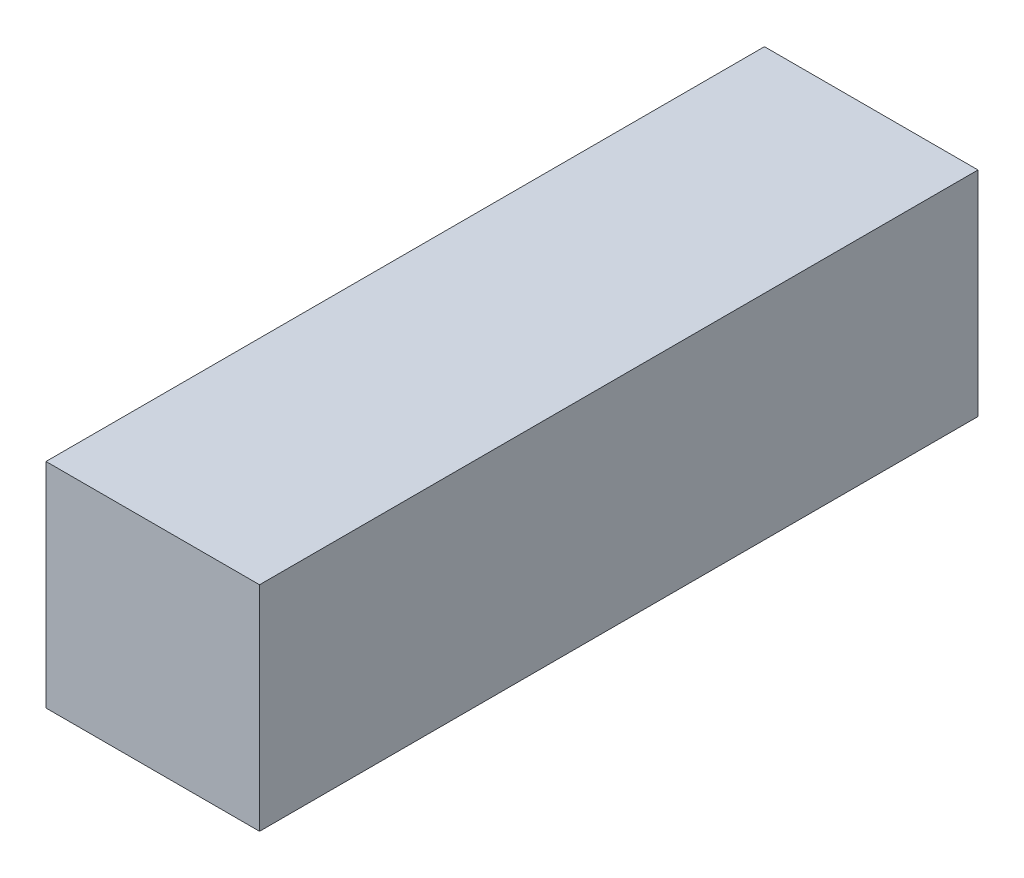
ISO-10303-21;
HEADER;
FILE_DESCRIPTION(('STEP AP214'),'2;1');
FILE_NAME('part.step','',(''),(''),'','','');
FILE_SCHEMA(('AUTOMOTIVE_DESIGN { 1 0 10303 214 1 1 1 1 }'));
ENDSEC;
DATA;
#1=APPLICATION_CONTEXT('core data for automotive mechanical design processes');
#2=APPLICATION_PROTOCOL_DEFINITION('international standard','automotive_design',2000,#1);
#3=PRODUCT_CONTEXT('',#1,'mechanical');
#4=PRODUCT('Part','Part','',(#3));
#5=PRODUCT_RELATED_PRODUCT_CATEGORY('part','',(#4));
#6=PRODUCT_DEFINITION_FORMATION('','',#4);
#7=PRODUCT_DEFINITION_CONTEXT('part definition',#1,'design');
#8=PRODUCT_DEFINITION('design','',#6,#7);
#9=PRODUCT_DEFINITION_SHAPE('','',#8);
#10=(LENGTH_UNIT() NAMED_UNIT(*) SI_UNIT(.MILLI.,.METRE.));
#11=(NAMED_UNIT(*) PLANE_ANGLE_UNIT() SI_UNIT($,.RADIAN.));
#12=(NAMED_UNIT(*) SI_UNIT($,.STERADIAN.) SOLID_ANGLE_UNIT());
#13=UNCERTAINTY_MEASURE_WITH_UNIT(LENGTH_MEASURE(1.E-05),#10,'distance_accuracy_value','');
#14=(GEOMETRIC_REPRESENTATION_CONTEXT(3) GLOBAL_UNCERTAINTY_ASSIGNED_CONTEXT((#13)) GLOBAL_UNIT_ASSIGNED_CONTEXT((#10,
#11,#12)) REPRESENTATION_CONTEXT('',''));
#15=CARTESIAN_POINT('',(0.,0.,0.));
#16=DIRECTION('',(0.,0.,1.));
#17=DIRECTION('',(1.,0.,0.));
#18=AXIS2_PLACEMENT_3D('',#15,#16,#17);
#19=CARTESIAN_POINT('',(-9.525,19.05,0.));
#20=DIRECTION('',(1.,0.,0.));
#21=DIRECTION('',(0.,0.,-1.));
#22=AXIS2_PLACEMENT_3D('',#19,#20,#21);
#23=PLANE('',#22);
#24=DIRECTION('',(0.,0.,1.));
#25=VECTOR('',#24,1.);
#26=CARTESIAN_POINT('',(-9.525,0.,0.));
#27=LINE('',#26,#25);
#28=CARTESIAN_POINT('',(-9.525,0.,0.));
#29=VERTEX_POINT('',#28);
#30=CARTESIAN_POINT('',(-9.52500000000001,0.,64.0912757557309));
#31=VERTEX_POINT('',#30);
#32=EDGE_CURVE('E96',#29,#31,#27,.T.);
#33=ORIENTED_EDGE('',*,*,#32,.T.);
#34=DIRECTION('',(0.,-1.,0.));
#35=VECTOR('',#34,1.);
#36=CARTESIAN_POINT('',(-9.52500000000001,19.05,64.0912757557309));
#37=LINE('',#36,#35);
#38=CARTESIAN_POINT('',(-9.52500000000001,19.05,64.0912757557309));
#39=VERTEX_POINT('',#38);
#40=EDGE_CURVE('E11',#39,#31,#37,.T.);
#41=ORIENTED_EDGE('',*,*,#40,.F.);
#42=DIRECTION('',(0.,0.,1.));
#43=VECTOR('',#42,1.);
#44=CARTESIAN_POINT('',(-9.525,19.05,0.));
#45=LINE('',#44,#43);
#46=CARTESIAN_POINT('',(-9.525,19.05,0.));
#47=VERTEX_POINT('',#46);
#48=EDGE_CURVE('E84',#47,#39,#45,.T.);
#49=ORIENTED_EDGE('',*,*,#48,.F.);
#50=DIRECTION('',(0.,-1.,0.));
#51=VECTOR('',#50,1.);
#52=CARTESIAN_POINT('',(-9.525,19.05,0.));
#53=LINE('',#52,#51);
#54=EDGE_CURVE('E92',#47,#29,#53,.T.);
#55=ORIENTED_EDGE('',*,*,#54,.T.);
#56=EDGE_LOOP('',(#33,#41,#49,#55));
#57=FACE_BOUND('',#56,.T.);
#58=ADVANCED_FACE('F33',(#57),#23,.F.);
#59=CARTESIAN_POINT('',(-9.52500000000001,19.05,64.0912757557309));
#60=DIRECTION('',(0.,0.,-1.));
#61=DIRECTION('',(-1.,0.,0.));
#62=AXIS2_PLACEMENT_3D('',#59,#60,#61);
#63=PLANE('',#62);
#64=DIRECTION('',(1.,0.,0.));
#65=VECTOR('',#64,1.);
#66=CARTESIAN_POINT('',(-9.52500000000001,0.,64.0912757557309));
#67=LINE('',#66,#65);
#68=CARTESIAN_POINT('',(9.52500000000003,0.,64.0912757557309));
#69=VERTEX_POINT('',#68);
#70=EDGE_CURVE('E88',#31,#69,#67,.T.);
#71=ORIENTED_EDGE('',*,*,#70,.T.);
#72=DIRECTION('',(0.,-1.,0.));
#73=VECTOR('',#72,1.);
#74=CARTESIAN_POINT('',(9.52500000000003,19.05,64.0912757557309));
#75=LINE('',#74,#73);
#76=CARTESIAN_POINT('',(9.52500000000003,19.05,64.0912757557309));
#77=VERTEX_POINT('',#76);
#78=EDGE_CURVE('E41',#77,#69,#75,.T.);
#79=ORIENTED_EDGE('',*,*,#78,.F.);
#80=DIRECTION('',(1.,0.,0.));
#81=VECTOR('',#80,1.);
#82=CARTESIAN_POINT('',(-9.52500000000001,19.05,64.0912757557309));
#83=LINE('',#82,#81);
#84=EDGE_CURVE('E79',#39,#77,#83,.T.);
#85=ORIENTED_EDGE('',*,*,#84,.F.);
#86=ORIENTED_EDGE('',*,*,#40,.T.);
#87=EDGE_LOOP('',(#71,#79,#85,#86));
#88=FACE_BOUND('',#87,.T.);
#89=ADVANCED_FACE('F87',(#88),#63,.F.);
#90=CARTESIAN_POINT('',(9.525,19.05,0.));
#91=DIRECTION('',(-1.,0.,0.));
#92=DIRECTION('',(0.,0.,1.));
#93=AXIS2_PLACEMENT_3D('',#90,#91,#92);
#94=PLANE('',#93);
#95=DIRECTION('',(0.,0.,-1.));
#96=VECTOR('',#95,1.);
#97=CARTESIAN_POINT('',(9.525,0.,0.));
#98=LINE('',#97,#96);
#99=CARTESIAN_POINT('',(9.525,0.,0.));
#100=VERTEX_POINT('',#99);
#101=EDGE_CURVE('E66',#69,#100,#98,.T.);
#102=ORIENTED_EDGE('',*,*,#101,.T.);
#103=DIRECTION('',(0.,-1.,0.));
#104=VECTOR('',#103,1.);
#105=CARTESIAN_POINT('',(9.525,19.05,0.));
#106=LINE('',#105,#104);
#107=CARTESIAN_POINT('',(9.525,19.05,0.));
#108=VERTEX_POINT('',#107);
#109=EDGE_CURVE('E89',#108,#100,#106,.T.);
#110=ORIENTED_EDGE('',*,*,#109,.F.);
#111=DIRECTION('',(0.,0.,-1.));
#112=VECTOR('',#111,1.);
#113=CARTESIAN_POINT('',(9.525,19.05,0.));
#114=LINE('',#113,#112);
#115=EDGE_CURVE('E82',#77,#108,#114,.T.);
#116=ORIENTED_EDGE('',*,*,#115,.F.);
#117=ORIENTED_EDGE('',*,*,#78,.T.);
#118=EDGE_LOOP('',(#102,#110,#116,#117));
#119=FACE_BOUND('',#118,.T.);
#120=ADVANCED_FACE('F90',(#119),#94,.F.);
#121=CARTESIAN_POINT('',(-9.525,19.05,0.));
#122=DIRECTION('',(0.,0.,1.));
#123=DIRECTION('',(1.,0.,0.));
#124=AXIS2_PLACEMENT_3D('',#121,#122,#123);
#125=PLANE('',#124);
#126=DIRECTION('',(-1.,0.,0.));
#127=VECTOR('',#126,1.);
#128=CARTESIAN_POINT('',(-9.525,0.,0.));
#129=LINE('',#128,#127);
#130=EDGE_CURVE('E72',#100,#29,#129,.T.);
#131=ORIENTED_EDGE('',*,*,#130,.T.);
#132=ORIENTED_EDGE('',*,*,#54,.F.);
#133=DIRECTION('',(-1.,0.,0.));
#134=VECTOR('',#133,1.);
#135=CARTESIAN_POINT('',(-9.525,19.05,0.));
#136=LINE('',#135,#134);
#137=EDGE_CURVE('E49',#108,#47,#136,.T.);
#138=ORIENTED_EDGE('',*,*,#137,.F.);
#139=ORIENTED_EDGE('',*,*,#109,.T.);
#140=EDGE_LOOP('',(#131,#132,#138,#139));
#141=FACE_BOUND('',#140,.T.);
#142=ADVANCED_FACE('F103',(#141),#125,.F.);
#143=CARTESIAN_POINT('',(0.,19.05,0.));
#144=DIRECTION('',(0.,1.,0.));
#145=DIRECTION('',(0.,0.,1.));
#146=AXIS2_PLACEMENT_3D('',#143,#144,#145);
#147=PLANE('',#146);
#148=ORIENTED_EDGE('',*,*,#48,.T.);
#149=ORIENTED_EDGE('',*,*,#84,.T.);
#150=ORIENTED_EDGE('',*,*,#115,.T.);
#151=ORIENTED_EDGE('',*,*,#137,.T.);
#152=EDGE_LOOP('',(#148,#149,#150,#151));
#153=FACE_BOUND('',#152,.T.);
#154=ADVANCED_FACE('F80',(#153),#147,.T.);
#155=CARTESIAN_POINT('',(0.,0.,0.));
#156=DIRECTION('',(0.,1.,0.));
#157=DIRECTION('',(0.,0.,1.));
#158=AXIS2_PLACEMENT_3D('',#155,#156,#157);
#159=PLANE('',#158);
#160=ORIENTED_EDGE('',*,*,#32,.F.);
#161=ORIENTED_EDGE('',*,*,#130,.F.);
#162=ORIENTED_EDGE('',*,*,#101,.F.);
#163=ORIENTED_EDGE('',*,*,#70,.F.);
#164=EDGE_LOOP('',(#160,#161,#162,#163));
#165=FACE_BOUND('',#164,.T.);
#166=ADVANCED_FACE('F106',(#165),#159,.F.);
#167=CLOSED_SHELL('',(#58,#89,#120,#142,#154,#166));
#168=MANIFOLD_SOLID_BREP('B2',#167);
#169=ADVANCED_BREP_SHAPE_REPRESENTATION('',(#18,#168),#14);
#170=SHAPE_DEFINITION_REPRESENTATION(#9,#169);
ENDSEC;
END-ISO-10303-21;
